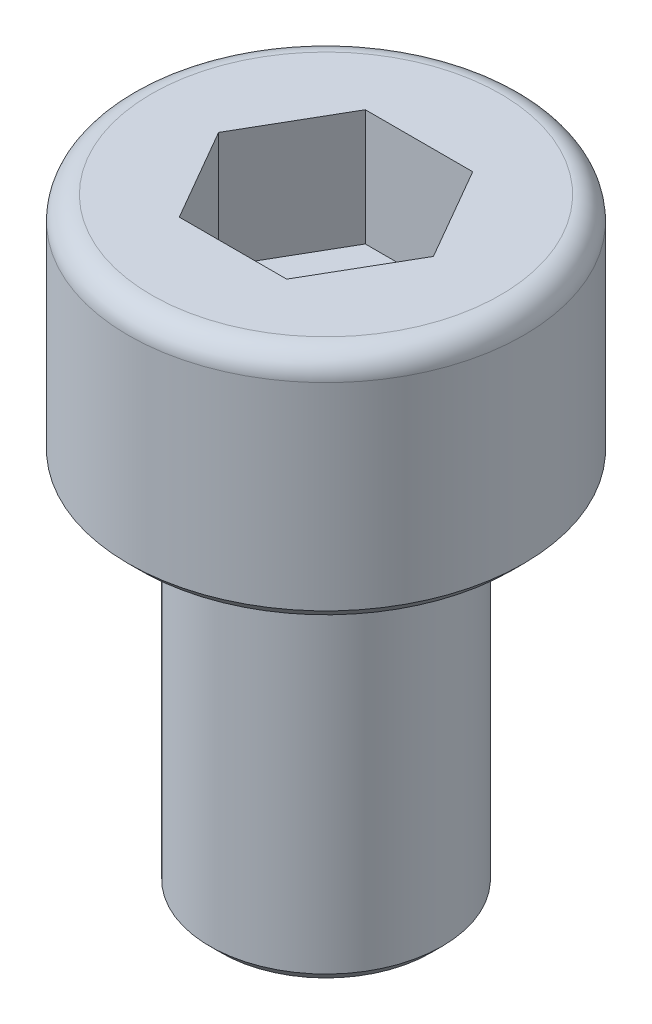
ISO-10303-21;
HEADER;
FILE_DESCRIPTION(('STEP AP214'),'2;1');
FILE_NAME('part.step','',(''),(''),'','','');
FILE_SCHEMA(('AUTOMOTIVE_DESIGN { 1 0 10303 214 1 1 1 1 }'));
ENDSEC;
DATA;
#1=APPLICATION_CONTEXT('core data for automotive mechanical design processes');
#2=APPLICATION_PROTOCOL_DEFINITION('international standard','automotive_design',2000,#1);
#3=PRODUCT_CONTEXT('',#1,'mechanical');
#4=PRODUCT('Part','Part','',(#3));
#5=PRODUCT_RELATED_PRODUCT_CATEGORY('part','',(#4));
#6=PRODUCT_DEFINITION_FORMATION('','',#4);
#7=PRODUCT_DEFINITION_CONTEXT('part definition',#1,'design');
#8=PRODUCT_DEFINITION('design','',#6,#7);
#9=PRODUCT_DEFINITION_SHAPE('','',#8);
#10=(LENGTH_UNIT() NAMED_UNIT(*) SI_UNIT(.MILLI.,.METRE.));
#11=(NAMED_UNIT(*) PLANE_ANGLE_UNIT() SI_UNIT($,.RADIAN.));
#12=(NAMED_UNIT(*) SI_UNIT($,.STERADIAN.) SOLID_ANGLE_UNIT());
#13=UNCERTAINTY_MEASURE_WITH_UNIT(LENGTH_MEASURE(1.E-05),#10,'distance_accuracy_value','');
#14=(GEOMETRIC_REPRESENTATION_CONTEXT(3) GLOBAL_UNCERTAINTY_ASSIGNED_CONTEXT((#13)) GLOBAL_UNIT_ASSIGNED_CONTEXT((#10,
#11,#12)) REPRESENTATION_CONTEXT('',''));
#15=CARTESIAN_POINT('',(0.,0.,0.));
#16=DIRECTION('',(0.,0.,1.));
#17=DIRECTION('',(1.,0.,0.));
#18=AXIS2_PLACEMENT_3D('',#15,#16,#17);
#19=CARTESIAN_POINT('',(0.,0.,0.));
#20=DIRECTION('',(0.,1.,0.));
#21=DIRECTION('',(-1.,0.,0.));
#22=AXIS2_PLACEMENT_3D('',#19,#20,#21);
#23=PLANE('',#22);
#24=CARTESIAN_POINT('',(0.,0.,0.));
#25=DIRECTION('',(0.,1.,0.));
#26=DIRECTION('',(-1.,0.,0.));
#27=AXIS2_PLACEMENT_3D('',#24,#25,#26);
#28=CIRCLE('',#27,3.75);
#29=CARTESIAN_POINT('',(-3.75,0.,0.));
#30=VERTEX_POINT('',#29);
#31=EDGE_CURVE('E165',#30,#30,#28,.T.);
#32=ORIENTED_EDGE('',*,*,#31,.T.);
#33=EDGE_LOOP('',(#32));
#34=FACE_BOUND('',#33,.T.);
#35=DIRECTION('',(0.5,0.,-0.866025403784439));
#36=VECTOR('',#35,1.);
#37=CARTESIAN_POINT('',(1.15470053837925,0.,2.));
#38=LINE('',#37,#36);
#39=CARTESIAN_POINT('',(1.15470053837925,0.,2.));
#40=VERTEX_POINT('',#39);
#41=CARTESIAN_POINT('',(2.3094010767585,0.,0.));
#42=VERTEX_POINT('',#41);
#43=EDGE_CURVE('E67',#40,#42,#38,.T.);
#44=ORIENTED_EDGE('',*,*,#43,.F.);
#45=DIRECTION('',(1.,0.,0.));
#46=VECTOR('',#45,1.);
#47=CARTESIAN_POINT('',(-1.15470053837925,0.,2.));
#48=LINE('',#47,#46);
#49=CARTESIAN_POINT('',(-1.15470053837925,0.,2.));
#50=VERTEX_POINT('',#49);
#51=EDGE_CURVE('E150',#50,#40,#48,.T.);
#52=ORIENTED_EDGE('',*,*,#51,.F.);
#53=DIRECTION('',(0.5,0.,0.866025403784439));
#54=VECTOR('',#53,1.);
#55=CARTESIAN_POINT('',(-2.3094010767585,0.,0.));
#56=LINE('',#55,#54);
#57=CARTESIAN_POINT('',(-2.3094010767585,0.,0.));
#58=VERTEX_POINT('',#57);
#59=EDGE_CURVE('E148',#58,#50,#56,.T.);
#60=ORIENTED_EDGE('',*,*,#59,.F.);
#61=DIRECTION('',(-0.5,0.,0.866025403784439));
#62=VECTOR('',#61,1.);
#63=CARTESIAN_POINT('',(-1.15470053837925,0.,-2.));
#64=LINE('',#63,#62);
#65=CARTESIAN_POINT('',(-1.15470053837925,0.,-2.));
#66=VERTEX_POINT('',#65);
#67=EDGE_CURVE('E115',#66,#58,#64,.T.);
#68=ORIENTED_EDGE('',*,*,#67,.F.);
#69=DIRECTION('',(-1.,0.,0.));
#70=VECTOR('',#69,1.);
#71=CARTESIAN_POINT('',(1.15470053837925,0.,-2.));
#72=LINE('',#71,#70);
#73=CARTESIAN_POINT('',(1.15470053837925,0.,-2.));
#74=VERTEX_POINT('',#73);
#75=EDGE_CURVE('E144',#74,#66,#72,.T.);
#76=ORIENTED_EDGE('',*,*,#75,.F.);
#77=DIRECTION('',(-0.5,0.,-0.866025403784438));
#78=VECTOR('',#77,1.);
#79=CARTESIAN_POINT('',(2.3094010767585,0.,0.));
#80=LINE('',#79,#78);
#81=EDGE_CURVE('E141',#42,#74,#80,.T.);
#82=ORIENTED_EDGE('',*,*,#81,.F.);
#83=EDGE_LOOP('',(#44,#52,#60,#68,#76,#82));
#84=FACE_BOUND('',#83,.T.);
#85=ADVANCED_FACE('F51',(#34,#84),#23,.T.);
#86=CARTESIAN_POINT('',(0.,-18.,0.));
#87=DIRECTION('',(0.,-1.,0.));
#88=DIRECTION('',(1.,0.,0.));
#89=AXIS2_PLACEMENT_3D('',#86,#87,#88);
#90=CYLINDRICAL_SURFACE('',#89,4.25);
#91=CARTESIAN_POINT('',(0.,-4.75,0.));
#92=DIRECTION('',(0.,-1.,0.));
#93=DIRECTION('',(1.,0.,0.));
#94=AXIS2_PLACEMENT_3D('',#91,#92,#93);
#95=CIRCLE('',#94,4.25);
#96=CARTESIAN_POINT('',(4.25,-4.75,0.));
#97=VERTEX_POINT('',#96);
#98=EDGE_CURVE('E171',#97,#97,#95,.F.);
#99=ORIENTED_EDGE('',*,*,#98,.T.);
#100=EDGE_LOOP('',(#99));
#101=FACE_BOUND('',#100,.T.);
#102=CARTESIAN_POINT('',(0.,-0.5,0.));
#103=DIRECTION('',(0.,1.,0.));
#104=DIRECTION('',(-1.,0.,0.));
#105=AXIS2_PLACEMENT_3D('',#102,#103,#104);
#106=CIRCLE('',#105,4.25);
#107=CARTESIAN_POINT('',(-4.25,-0.5,0.));
#108=VERTEX_POINT('',#107);
#109=EDGE_CURVE('E162',#108,#108,#106,.F.);
#110=ORIENTED_EDGE('',*,*,#109,.T.);
#111=EDGE_LOOP('',(#110));
#112=FACE_BOUND('',#111,.T.);
#113=ADVANCED_FACE('F190',(#101,#112),#90,.T.);
#114=CARTESIAN_POINT('',(4.25,-5.,0.));
#115=DIRECTION('',(0.,-1.,0.));
#116=DIRECTION('',(1.,0.,0.));
#117=AXIS2_PLACEMENT_3D('',#114,#115,#116);
#118=PLANE('',#117);
#119=CARTESIAN_POINT('',(0.,-5.,0.));
#120=DIRECTION('',(0.,-1.,0.));
#121=DIRECTION('',(1.,0.,0.));
#122=AXIS2_PLACEMENT_3D('',#119,#120,#121);
#123=CIRCLE('',#122,4.);
#124=CARTESIAN_POINT('',(4.,-5.,0.));
#125=VERTEX_POINT('',#124);
#126=EDGE_CURVE('E168',#125,#125,#123,.T.);
#127=ORIENTED_EDGE('',*,*,#126,.T.);
#128=EDGE_LOOP('',(#127));
#129=FACE_BOUND('',#128,.T.);
#130=CARTESIAN_POINT('',(0.,-5.,0.));
#131=DIRECTION('',(0.,-1.,0.));
#132=DIRECTION('',(1.,0.,0.));
#133=AXIS2_PLACEMENT_3D('',#130,#131,#132);
#134=CIRCLE('',#133,2.5);
#135=CARTESIAN_POINT('',(2.5,-5.,0.));
#136=VERTEX_POINT('',#135);
#137=EDGE_CURVE('E154',#136,#136,#134,.T.);
#138=ORIENTED_EDGE('',*,*,#137,.F.);
#139=EDGE_LOOP('',(#138));
#140=FACE_BOUND('',#139,.T.);
#141=ADVANCED_FACE('F198',(#129,#140),#118,.T.);
#142=CARTESIAN_POINT('',(0.,-18.,0.));
#143=DIRECTION('',(0.,-1.,0.));
#144=DIRECTION('',(1.,0.,0.));
#145=AXIS2_PLACEMENT_3D('',#142,#143,#144);
#146=CYLINDRICAL_SURFACE('',#145,2.5);
#147=CARTESIAN_POINT('',(0.,-12.75,0.));
#148=DIRECTION('',(0.,-1.,0.));
#149=DIRECTION('',(1.,0.,0.));
#150=AXIS2_PLACEMENT_3D('',#147,#148,#149);
#151=CIRCLE('',#150,2.5);
#152=CARTESIAN_POINT('',(2.5,-12.75,0.));
#153=VERTEX_POINT('',#152);
#154=EDGE_CURVE('E11',#153,#153,#151,.F.);
#155=ORIENTED_EDGE('',*,*,#154,.T.);
#156=EDGE_LOOP('',(#155));
#157=FACE_BOUND('',#156,.T.);
#158=ORIENTED_EDGE('',*,*,#137,.T.);
#159=EDGE_LOOP('',(#158));
#160=FACE_BOUND('',#159,.T.);
#161=ADVANCED_FACE('F239',(#157,#160),#146,.T.);
#162=CARTESIAN_POINT('',(2.5,-13.,0.));
#163=DIRECTION('',(0.,-1.,0.));
#164=DIRECTION('',(1.,0.,0.));
#165=AXIS2_PLACEMENT_3D('',#162,#163,#164);
#166=PLANE('',#165);
#167=CARTESIAN_POINT('',(0.,-13.,0.));
#168=DIRECTION('',(0.,-1.,0.));
#169=DIRECTION('',(1.,0.,0.));
#170=AXIS2_PLACEMENT_3D('',#167,#168,#169);
#171=CIRCLE('',#170,2.25);
#172=CARTESIAN_POINT('',(2.25,-13.,0.));
#173=VERTEX_POINT('',#172);
#174=EDGE_CURVE('E60',#173,#173,#171,.T.);
#175=ORIENTED_EDGE('',*,*,#174,.T.);
#176=EDGE_LOOP('',(#175));
#177=FACE_BOUND('',#176,.T.);
#178=ADVANCED_FACE('F176',(#177),#166,.T.);
#179=CARTESIAN_POINT('',(1.15470053837925,-2.5,2.));
#180=DIRECTION('',(0.866025403784439,0.,0.5));
#181=DIRECTION('',(0.5,0.,-0.866025403784439));
#182=AXIS2_PLACEMENT_3D('',#179,#180,#181);
#183=PLANE('',#182);
#184=ORIENTED_EDGE('',*,*,#43,.T.);
#185=DIRECTION('',(0.,1.,0.));
#186=VECTOR('',#185,1.);
#187=CARTESIAN_POINT('',(2.3094010767585,-2.5,0.));
#188=LINE('',#187,#186);
#189=CARTESIAN_POINT('',(2.3094010767585,-2.5,0.));
#190=VERTEX_POINT('',#189);
#191=EDGE_CURVE('E97',#190,#42,#188,.T.);
#192=ORIENTED_EDGE('',*,*,#191,.F.);
#193=DIRECTION('',(0.5,0.,-0.866025403784439));
#194=VECTOR('',#193,1.);
#195=CARTESIAN_POINT('',(1.15470053837925,-2.5,2.));
#196=LINE('',#195,#194);
#197=CARTESIAN_POINT('',(1.15470053837925,-2.5,2.));
#198=VERTEX_POINT('',#197);
#199=EDGE_CURVE('E152',#198,#190,#196,.T.);
#200=ORIENTED_EDGE('',*,*,#199,.F.);
#201=DIRECTION('',(0.,1.,0.));
#202=VECTOR('',#201,1.);
#203=CARTESIAN_POINT('',(1.15470053837925,-2.5,2.));
#204=LINE('',#203,#202);
#205=EDGE_CURVE('E75',#198,#40,#204,.T.);
#206=ORIENTED_EDGE('',*,*,#205,.T.);
#207=EDGE_LOOP('',(#184,#192,#200,#206));
#208=FACE_BOUND('',#207,.T.);
#209=ADVANCED_FACE('F228',(#208),#183,.F.);
#210=CARTESIAN_POINT('',(-1.15470053837925,-2.5,2.));
#211=DIRECTION('',(0.,0.,1.));
#212=DIRECTION('',(1.,0.,0.));
#213=AXIS2_PLACEMENT_3D('',#210,#211,#212);
#214=PLANE('',#213);
#215=ORIENTED_EDGE('',*,*,#51,.T.);
#216=ORIENTED_EDGE('',*,*,#205,.F.);
#217=DIRECTION('',(1.,0.,0.));
#218=VECTOR('',#217,1.);
#219=CARTESIAN_POINT('',(-1.15470053837925,-2.5,2.));
#220=LINE('',#219,#218);
#221=CARTESIAN_POINT('',(-1.15470053837925,-2.5,2.));
#222=VERTEX_POINT('',#221);
#223=EDGE_CURVE('E127',#222,#198,#220,.T.);
#224=ORIENTED_EDGE('',*,*,#223,.F.);
#225=DIRECTION('',(0.,1.,0.));
#226=VECTOR('',#225,1.);
#227=CARTESIAN_POINT('',(-1.15470053837925,-2.5,2.));
#228=LINE('',#227,#226);
#229=EDGE_CURVE('E119',#222,#50,#228,.T.);
#230=ORIENTED_EDGE('',*,*,#229,.T.);
#231=EDGE_LOOP('',(#215,#216,#224,#230));
#232=FACE_BOUND('',#231,.T.);
#233=ADVANCED_FACE('F225',(#232),#214,.F.);
#234=CARTESIAN_POINT('',(-2.3094010767585,-2.5,0.));
#235=DIRECTION('',(-0.866025403784439,0.,0.5));
#236=DIRECTION('',(0.5,0.,0.866025403784439));
#237=AXIS2_PLACEMENT_3D('',#234,#235,#236);
#238=PLANE('',#237);
#239=ORIENTED_EDGE('',*,*,#59,.T.);
#240=ORIENTED_EDGE('',*,*,#229,.F.);
#241=DIRECTION('',(0.5,0.,0.866025403784439));
#242=VECTOR('',#241,1.);
#243=CARTESIAN_POINT('',(-2.3094010767585,-2.5,0.));
#244=LINE('',#243,#242);
#245=CARTESIAN_POINT('',(-2.3094010767585,-2.5,0.));
#246=VERTEX_POINT('',#245);
#247=EDGE_CURVE('E123',#246,#222,#244,.T.);
#248=ORIENTED_EDGE('',*,*,#247,.F.);
#249=DIRECTION('',(0.,1.,0.));
#250=VECTOR('',#249,1.);
#251=CARTESIAN_POINT('',(-2.3094010767585,-2.5,0.));
#252=LINE('',#251,#250);
#253=EDGE_CURVE('E108',#246,#58,#252,.T.);
#254=ORIENTED_EDGE('',*,*,#253,.T.);
#255=EDGE_LOOP('',(#239,#240,#248,#254));
#256=FACE_BOUND('',#255,.T.);
#257=ADVANCED_FACE('F124',(#256),#238,.F.);
#258=CARTESIAN_POINT('',(-1.15470053837925,-2.5,-2.));
#259=DIRECTION('',(-0.866025403784439,0.,-0.5));
#260=DIRECTION('',(-0.5,0.,0.866025403784439));
#261=AXIS2_PLACEMENT_3D('',#258,#259,#260);
#262=PLANE('',#261);
#263=ORIENTED_EDGE('',*,*,#67,.T.);
#264=ORIENTED_EDGE('',*,*,#253,.F.);
#265=DIRECTION('',(-0.5,0.,0.866025403784439));
#266=VECTOR('',#265,1.);
#267=CARTESIAN_POINT('',(-1.15470053837925,-2.5,-2.));
#268=LINE('',#267,#266);
#269=CARTESIAN_POINT('',(-1.15470053837925,-2.5,-2.));
#270=VERTEX_POINT('',#269);
#271=EDGE_CURVE('E112',#270,#246,#268,.T.);
#272=ORIENTED_EDGE('',*,*,#271,.F.);
#273=DIRECTION('',(0.,1.,0.));
#274=VECTOR('',#273,1.);
#275=CARTESIAN_POINT('',(-1.15470053837925,-2.5,-2.));
#276=LINE('',#275,#274);
#277=EDGE_CURVE('E120',#270,#66,#276,.T.);
#278=ORIENTED_EDGE('',*,*,#277,.T.);
#279=EDGE_LOOP('',(#263,#264,#272,#278));
#280=FACE_BOUND('',#279,.T.);
#281=ADVANCED_FACE('F110',(#280),#262,.F.);
#282=CARTESIAN_POINT('',(1.15470053837925,-2.5,-2.));
#283=DIRECTION('',(0.,0.,-1.));
#284=DIRECTION('',(-1.,0.,0.));
#285=AXIS2_PLACEMENT_3D('',#282,#283,#284);
#286=PLANE('',#285);
#287=ORIENTED_EDGE('',*,*,#75,.T.);
#288=ORIENTED_EDGE('',*,*,#277,.F.);
#289=DIRECTION('',(-1.,0.,0.));
#290=VECTOR('',#289,1.);
#291=CARTESIAN_POINT('',(1.15470053837925,-2.5,-2.));
#292=LINE('',#291,#290);
#293=CARTESIAN_POINT('',(1.15470053837925,-2.5,-2.));
#294=VERTEX_POINT('',#293);
#295=EDGE_CURVE('E133',#294,#270,#292,.T.);
#296=ORIENTED_EDGE('',*,*,#295,.F.);
#297=DIRECTION('',(0.,1.,0.));
#298=VECTOR('',#297,1.);
#299=CARTESIAN_POINT('',(1.15470053837925,-2.5,-2.));
#300=LINE('',#299,#298);
#301=EDGE_CURVE('E157',#294,#74,#300,.T.);
#302=ORIENTED_EDGE('',*,*,#301,.T.);
#303=EDGE_LOOP('',(#287,#288,#296,#302));
#304=FACE_BOUND('',#303,.T.);
#305=ADVANCED_FACE('F221',(#304),#286,.F.);
#306=CARTESIAN_POINT('',(2.3094010767585,-2.5,0.));
#307=DIRECTION('',(0.866025403784439,0.,-0.5));
#308=DIRECTION('',(-0.5,0.,-0.866025403784439));
#309=AXIS2_PLACEMENT_3D('',#306,#307,#308);
#310=PLANE('',#309);
#311=ORIENTED_EDGE('',*,*,#81,.T.);
#312=ORIENTED_EDGE('',*,*,#301,.F.);
#313=DIRECTION('',(-0.5,0.,-0.866025403784438));
#314=VECTOR('',#313,1.);
#315=CARTESIAN_POINT('',(2.3094010767585,-2.5,0.));
#316=LINE('',#315,#314);
#317=EDGE_CURVE('E135',#190,#294,#316,.T.);
#318=ORIENTED_EDGE('',*,*,#317,.F.);
#319=ORIENTED_EDGE('',*,*,#191,.T.);
#320=EDGE_LOOP('',(#311,#312,#318,#319));
#321=FACE_BOUND('',#320,.T.);
#322=ADVANCED_FACE('F212',(#321),#310,.F.);
#323=CARTESIAN_POINT('',(0.,-2.5,0.));
#324=DIRECTION('',(0.,1.,0.));
#325=DIRECTION('',(-1.,0.,0.));
#326=AXIS2_PLACEMENT_3D('',#323,#324,#325);
#327=PLANE('',#326);
#328=ORIENTED_EDGE('',*,*,#199,.T.);
#329=ORIENTED_EDGE('',*,*,#317,.T.);
#330=ORIENTED_EDGE('',*,*,#295,.T.);
#331=ORIENTED_EDGE('',*,*,#271,.T.);
#332=ORIENTED_EDGE('',*,*,#247,.T.);
#333=ORIENTED_EDGE('',*,*,#223,.T.);
#334=EDGE_LOOP('',(#328,#329,#330,#331,#332,#333));
#335=FACE_BOUND('',#334,.T.);
#336=ADVANCED_FACE('F130',(#335),#327,.T.);
#337=CARTESIAN_POINT('',(0.,-0.5,0.));
#338=DIRECTION('',(0.,1.,0.));
#339=DIRECTION('',(-1.,0.,0.));
#340=AXIS2_PLACEMENT_3D('',#337,#338,#339);
#341=TOROIDAL_SURFACE('',#340,3.75,0.5);
#342=ORIENTED_EDGE('',*,*,#31,.F.);
#343=EDGE_LOOP('',(#342));
#344=FACE_BOUND('',#343,.T.);
#345=ORIENTED_EDGE('',*,*,#109,.F.);
#346=EDGE_LOOP('',(#345));
#347=FACE_BOUND('',#346,.T.);
#348=ADVANCED_FACE('F186',(#344,#347),#341,.T.);
#349=CARTESIAN_POINT('',(0.,-5.,0.));
#350=DIRECTION('',(0.,1.,0.));
#351=DIRECTION('',(-1.,0.,0.));
#352=AXIS2_PLACEMENT_3D('',#349,#350,#351);
#353=CONICAL_SURFACE('',#352,4.,0.785398163397448);
#354=ORIENTED_EDGE('',*,*,#98,.F.);
#355=EDGE_LOOP('',(#354));
#356=FACE_BOUND('',#355,.T.);
#357=ORIENTED_EDGE('',*,*,#126,.F.);
#358=EDGE_LOOP('',(#357));
#359=FACE_BOUND('',#358,.T.);
#360=ADVANCED_FACE('F179',(#356,#359),#353,.T.);
#361=CARTESIAN_POINT('',(0.,-13.,0.));
#362=DIRECTION('',(0.,1.,0.));
#363=DIRECTION('',(-1.,0.,0.));
#364=AXIS2_PLACEMENT_3D('',#361,#362,#363);
#365=CONICAL_SURFACE('',#364,2.25,0.785398163397442);
#366=ORIENTED_EDGE('',*,*,#154,.F.);
#367=EDGE_LOOP('',(#366));
#368=FACE_BOUND('',#367,.T.);
#369=ORIENTED_EDGE('',*,*,#174,.F.);
#370=EDGE_LOOP('',(#369));
#371=FACE_BOUND('',#370,.T.);
#372=ADVANCED_FACE('F54',(#368,#371),#365,.T.);
#373=CLOSED_SHELL('',(#85,#113,#141,#161,#178,#209,#233,#257,#281,#305,#322,#336,#348,#360,#372));
#374=MANIFOLD_SOLID_BREP('B2',#373);
#375=ADVANCED_BREP_SHAPE_REPRESENTATION('',(#18,#374),#14);
#376=SHAPE_DEFINITION_REPRESENTATION(#9,#375);
ENDSEC;
END-ISO-10303-21;
